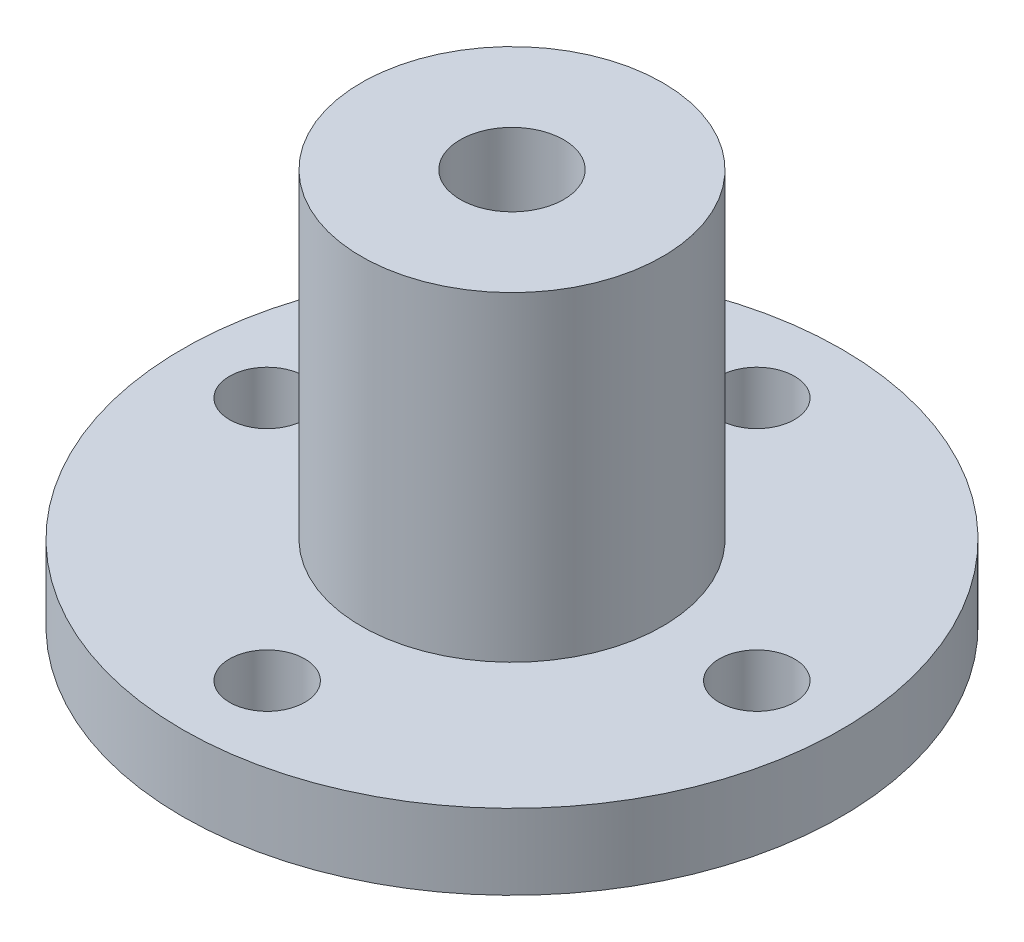
ISO-10303-21;
HEADER;
FILE_DESCRIPTION(('STEP AP214'),'2;1');
FILE_NAME('part.step','',(''),(''),'','','');
FILE_SCHEMA(('AUTOMOTIVE_DESIGN { 1 0 10303 214 1 1 1 1 }'));
ENDSEC;
DATA;
#1=APPLICATION_CONTEXT('core data for automotive mechanical design processes');
#2=APPLICATION_PROTOCOL_DEFINITION('international standard','automotive_design',2000,#1);
#3=PRODUCT_CONTEXT('',#1,'mechanical');
#4=PRODUCT('Part','Part','',(#3));
#5=PRODUCT_RELATED_PRODUCT_CATEGORY('part','',(#4));
#6=PRODUCT_DEFINITION_FORMATION('','',#4);
#7=PRODUCT_DEFINITION_CONTEXT('part definition',#1,'design');
#8=PRODUCT_DEFINITION('design','',#6,#7);
#9=PRODUCT_DEFINITION_SHAPE('','',#8);
#10=(LENGTH_UNIT() NAMED_UNIT(*) SI_UNIT(.MILLI.,.METRE.));
#11=(NAMED_UNIT(*) PLANE_ANGLE_UNIT() SI_UNIT($,.RADIAN.));
#12=(NAMED_UNIT(*) SI_UNIT($,.STERADIAN.) SOLID_ANGLE_UNIT());
#13=UNCERTAINTY_MEASURE_WITH_UNIT(LENGTH_MEASURE(1.E-05),#10,'distance_accuracy_value','');
#14=(GEOMETRIC_REPRESENTATION_CONTEXT(3) GLOBAL_UNCERTAINTY_ASSIGNED_CONTEXT((#13)) GLOBAL_UNIT_ASSIGNED_CONTEXT((#10,
#11,#12)) REPRESENTATION_CONTEXT('',''));
#15=CARTESIAN_POINT('',(0.,0.,0.));
#16=DIRECTION('',(0.,0.,1.));
#17=DIRECTION('',(1.,0.,0.));
#18=AXIS2_PLACEMENT_3D('',#15,#16,#17);
#19=CARTESIAN_POINT('',(0.,4.,0.));
#20=DIRECTION('',(0.,1.,0.));
#21=DIRECTION('',(0.,0.,1.));
#22=AXIS2_PLACEMENT_3D('',#19,#20,#21);
#23=PLANE('',#22);
#24=CARTESIAN_POINT('',(0.,4.,13.));
#25=DIRECTION('',(0.,1.,0.));
#26=DIRECTION('',(0.,0.,1.));
#27=AXIS2_PLACEMENT_3D('',#24,#25,#26);
#28=CIRCLE('',#27,2.);
#29=CARTESIAN_POINT('',(0.,4.,15.));
#30=VERTEX_POINT('',#29);
#31=EDGE_CURVE('E70',#30,#30,#28,.T.);
#32=ORIENTED_EDGE('',*,*,#31,.F.);
#33=EDGE_LOOP('',(#32));
#34=FACE_BOUND('',#33,.T.);
#35=CARTESIAN_POINT('',(0.,4.,-13.));
#36=DIRECTION('',(0.,1.,0.));
#37=DIRECTION('',(0.,0.,1.));
#38=AXIS2_PLACEMENT_3D('',#35,#36,#37);
#39=CIRCLE('',#38,2.);
#40=CARTESIAN_POINT('',(0.,4.,-11.));
#41=VERTEX_POINT('',#40);
#42=EDGE_CURVE('E57',#41,#41,#39,.T.);
#43=ORIENTED_EDGE('',*,*,#42,.F.);
#44=EDGE_LOOP('',(#43));
#45=FACE_BOUND('',#44,.T.);
#46=CARTESIAN_POINT('',(0.,4.,0.));
#47=DIRECTION('',(0.,1.,0.));
#48=DIRECTION('',(0.,0.,1.));
#49=AXIS2_PLACEMENT_3D('',#46,#47,#48);
#50=CIRCLE('',#49,17.5);
#51=CARTESIAN_POINT('',(0.,4.,17.5));
#52=VERTEX_POINT('',#51);
#53=EDGE_CURVE('E10',#52,#52,#50,.T.);
#54=ORIENTED_EDGE('',*,*,#53,.T.);
#55=EDGE_LOOP('',(#54));
#56=FACE_BOUND('',#55,.T.);
#57=CARTESIAN_POINT('',(0.,4.,0.));
#58=DIRECTION('',(0.,1.,0.));
#59=DIRECTION('',(0.,0.,1.));
#60=AXIS2_PLACEMENT_3D('',#57,#58,#59);
#61=CIRCLE('',#60,8.);
#62=CARTESIAN_POINT('',(0.,4.,-8.));
#63=VERTEX_POINT('',#62);
#64=EDGE_CURVE('E52',#63,#63,#61,.T.);
#65=ORIENTED_EDGE('',*,*,#64,.F.);
#66=EDGE_LOOP('',(#65));
#67=FACE_BOUND('',#66,.T.);
#68=CARTESIAN_POINT('',(13.,4.,0.));
#69=DIRECTION('',(0.,1.,0.));
#70=DIRECTION('',(0.,0.,1.));
#71=AXIS2_PLACEMENT_3D('',#68,#69,#70);
#72=CIRCLE('',#71,2.);
#73=CARTESIAN_POINT('',(13.,4.,2.00000000000005));
#74=VERTEX_POINT('',#73);
#75=EDGE_CURVE('E62',#74,#74,#72,.T.);
#76=ORIENTED_EDGE('',*,*,#75,.F.);
#77=EDGE_LOOP('',(#76));
#78=FACE_BOUND('',#77,.T.);
#79=CARTESIAN_POINT('',(-13.,4.,-1.36167772214882E-13));
#80=DIRECTION('',(0.,1.,0.));
#81=DIRECTION('',(0.,0.,1.));
#82=AXIS2_PLACEMENT_3D('',#79,#80,#81);
#83=CIRCLE('',#82,2.);
#84=CARTESIAN_POINT('',(-13.,4.,1.99999999999986));
#85=VERTEX_POINT('',#84);
#86=EDGE_CURVE('E78',#85,#85,#83,.T.);
#87=ORIENTED_EDGE('',*,*,#86,.F.);
#88=EDGE_LOOP('',(#87));
#89=FACE_BOUND('',#88,.T.);
#90=ADVANCED_FACE('F39',(#34,#45,#56,#67,#78,#89),#23,.T.);
#91=CARTESIAN_POINT('',(0.,0.,0.));
#92=DIRECTION('',(0.,1.,0.));
#93=DIRECTION('',(0.,0.,1.));
#94=AXIS2_PLACEMENT_3D('',#91,#92,#93);
#95=PLANE('',#94);
#96=CARTESIAN_POINT('',(0.,0.,0.));
#97=DIRECTION('',(0.,-1.,0.));
#98=DIRECTION('',(0.,0.,-1.));
#99=AXIS2_PLACEMENT_3D('',#96,#97,#98);
#100=CIRCLE('',#99,5.5);
#101=CARTESIAN_POINT('',(0.,0.,-5.5));
#102=VERTEX_POINT('',#101);
#103=EDGE_CURVE('E93',#102,#102,#100,.T.);
#104=ORIENTED_EDGE('',*,*,#103,.F.);
#105=EDGE_LOOP('',(#104));
#106=FACE_BOUND('',#105,.T.);
#107=CARTESIAN_POINT('',(0.,0.,0.));
#108=DIRECTION('',(0.,1.,0.));
#109=DIRECTION('',(0.,0.,1.));
#110=AXIS2_PLACEMENT_3D('',#107,#108,#109);
#111=CIRCLE('',#110,17.5);
#112=CARTESIAN_POINT('',(0.,0.,17.5));
#113=VERTEX_POINT('',#112);
#114=EDGE_CURVE('E43',#113,#113,#111,.T.);
#115=ORIENTED_EDGE('',*,*,#114,.F.);
#116=EDGE_LOOP('',(#115));
#117=FACE_BOUND('',#116,.T.);
#118=CARTESIAN_POINT('',(0.,0.,-13.));
#119=DIRECTION('',(0.,1.,0.));
#120=DIRECTION('',(0.,0.,1.));
#121=AXIS2_PLACEMENT_3D('',#118,#119,#120);
#122=CIRCLE('',#121,2.);
#123=CARTESIAN_POINT('',(0.,0.,-11.));
#124=VERTEX_POINT('',#123);
#125=EDGE_CURVE('E58',#124,#124,#122,.T.);
#126=ORIENTED_EDGE('',*,*,#125,.T.);
#127=EDGE_LOOP('',(#126));
#128=FACE_BOUND('',#127,.T.);
#129=CARTESIAN_POINT('',(13.,0.,0.));
#130=DIRECTION('',(0.,1.,0.));
#131=DIRECTION('',(0.,0.,1.));
#132=AXIS2_PLACEMENT_3D('',#129,#130,#131);
#133=CIRCLE('',#132,2.);
#134=CARTESIAN_POINT('',(13.,0.,2.00000000000005));
#135=VERTEX_POINT('',#134);
#136=EDGE_CURVE('E66',#135,#135,#133,.T.);
#137=ORIENTED_EDGE('',*,*,#136,.T.);
#138=EDGE_LOOP('',(#137));
#139=FACE_BOUND('',#138,.T.);
#140=CARTESIAN_POINT('',(0.,0.,13.));
#141=DIRECTION('',(0.,1.,0.));
#142=DIRECTION('',(0.,0.,1.));
#143=AXIS2_PLACEMENT_3D('',#140,#141,#142);
#144=CIRCLE('',#143,2.);
#145=CARTESIAN_POINT('',(0.,0.,15.));
#146=VERTEX_POINT('',#145);
#147=EDGE_CURVE('E74',#146,#146,#144,.T.);
#148=ORIENTED_EDGE('',*,*,#147,.T.);
#149=EDGE_LOOP('',(#148));
#150=FACE_BOUND('',#149,.T.);
#151=CARTESIAN_POINT('',(-13.,0.,-1.36167772214882E-13));
#152=DIRECTION('',(0.,1.,0.));
#153=DIRECTION('',(0.,0.,1.));
#154=AXIS2_PLACEMENT_3D('',#151,#152,#153);
#155=CIRCLE('',#154,2.);
#156=CARTESIAN_POINT('',(-13.,0.,1.99999999999986));
#157=VERTEX_POINT('',#156);
#158=EDGE_CURVE('E82',#157,#157,#155,.T.);
#159=ORIENTED_EDGE('',*,*,#158,.T.);
#160=EDGE_LOOP('',(#159));
#161=FACE_BOUND('',#160,.T.);
#162=ADVANCED_FACE('F167',(#106,#117,#128,#139,#150,#161),#95,.F.);
#163=CARTESIAN_POINT('',(0.,4.,0.));
#164=DIRECTION('',(0.,-1.,0.));
#165=DIRECTION('',(0.,0.,-1.));
#166=AXIS2_PLACEMENT_3D('',#163,#164,#165);
#167=CYLINDRICAL_SURFACE('',#166,17.5);
#168=ORIENTED_EDGE('',*,*,#53,.F.);
#169=EDGE_LOOP('',(#168));
#170=FACE_BOUND('',#169,.T.);
#171=ORIENTED_EDGE('',*,*,#114,.T.);
#172=EDGE_LOOP('',(#171));
#173=FACE_BOUND('',#172,.T.);
#174=ADVANCED_FACE('F41',(#170,#173),#167,.T.);
#175=CARTESIAN_POINT('',(0.,4.,-13.));
#176=DIRECTION('',(0.,-1.,0.));
#177=DIRECTION('',(0.,0.,-1.));
#178=AXIS2_PLACEMENT_3D('',#175,#176,#177);
#179=CYLINDRICAL_SURFACE('',#178,2.);
#180=ORIENTED_EDGE('',*,*,#42,.T.);
#181=EDGE_LOOP('',(#180));
#182=FACE_BOUND('',#181,.T.);
#183=ORIENTED_EDGE('',*,*,#125,.F.);
#184=EDGE_LOOP('',(#183));
#185=FACE_BOUND('',#184,.T.);
#186=ADVANCED_FACE('F177',(#182,#185),#179,.F.);
#187=CARTESIAN_POINT('',(13.,4.,0.));
#188=DIRECTION('',(0.,-1.,0.));
#189=DIRECTION('',(0.,0.,-1.));
#190=AXIS2_PLACEMENT_3D('',#187,#188,#189);
#191=CYLINDRICAL_SURFACE('',#190,2.);
#192=ORIENTED_EDGE('',*,*,#75,.T.);
#193=EDGE_LOOP('',(#192));
#194=FACE_BOUND('',#193,.T.);
#195=ORIENTED_EDGE('',*,*,#136,.F.);
#196=EDGE_LOOP('',(#195));
#197=FACE_BOUND('',#196,.T.);
#198=ADVANCED_FACE('F180',(#194,#197),#191,.F.);
#199=CARTESIAN_POINT('',(0.,4.,13.));
#200=DIRECTION('',(0.,-1.,0.));
#201=DIRECTION('',(0.,0.,-1.));
#202=AXIS2_PLACEMENT_3D('',#199,#200,#201);
#203=CYLINDRICAL_SURFACE('',#202,2.);
#204=ORIENTED_EDGE('',*,*,#31,.T.);
#205=EDGE_LOOP('',(#204));
#206=FACE_BOUND('',#205,.T.);
#207=ORIENTED_EDGE('',*,*,#147,.F.);
#208=EDGE_LOOP('',(#207));
#209=FACE_BOUND('',#208,.T.);
#210=ADVANCED_FACE('F184',(#206,#209),#203,.F.);
#211=CARTESIAN_POINT('',(-13.,4.,-1.36167772214882E-13));
#212=DIRECTION('',(0.,-1.,0.));
#213=DIRECTION('',(0.,0.,-1.));
#214=AXIS2_PLACEMENT_3D('',#211,#212,#213);
#215=CYLINDRICAL_SURFACE('',#214,2.);
#216=ORIENTED_EDGE('',*,*,#86,.T.);
#217=EDGE_LOOP('',(#216));
#218=FACE_BOUND('',#217,.T.);
#219=ORIENTED_EDGE('',*,*,#158,.F.);
#220=EDGE_LOOP('',(#219));
#221=FACE_BOUND('',#220,.T.);
#222=ADVANCED_FACE('F188',(#218,#221),#215,.F.);
#223=CARTESIAN_POINT('',(0.,21.,0.));
#224=DIRECTION('',(0.,-1.,0.));
#225=DIRECTION('',(0.,0.,-1.));
#226=AXIS2_PLACEMENT_3D('',#223,#224,#225);
#227=CYLINDRICAL_SURFACE('',#226,8.);
#228=CARTESIAN_POINT('',(0.,21.,0.));
#229=DIRECTION('',(0.,1.,0.));
#230=DIRECTION('',(0.,0.,1.));
#231=AXIS2_PLACEMENT_3D('',#228,#229,#230);
#232=CIRCLE('',#231,8.);
#233=CARTESIAN_POINT('',(0.,21.,-8.));
#234=VERTEX_POINT('',#233);
#235=EDGE_CURVE('E86',#234,#234,#232,.T.);
#236=CARTESIAN_POINT('',(0.,4.,-8.));
#237=CARTESIAN_POINT('',(0.,4.17708333333333,-8.));
#238=CARTESIAN_POINT('',(0.,4.35416666666666,-8.));
#239=CARTESIAN_POINT('',(0.,4.70833333333333,-8.));
#240=CARTESIAN_POINT('',(0.,4.88541666666666,-8.));
#241=CARTESIAN_POINT('',(0.,5.23958333333333,-8.));
#242=CARTESIAN_POINT('',(0.,5.41666666666666,-8.));
#243=CARTESIAN_POINT('',(0.,5.77083333333333,-8.));
#244=CARTESIAN_POINT('',(0.,5.94791666666666,-8.));
#245=CARTESIAN_POINT('',(0.,6.30208333333333,-8.));
#246=CARTESIAN_POINT('',(0.,6.47916666666666,-8.));
#247=CARTESIAN_POINT('',(0.,6.83333333333333,-8.));
#248=CARTESIAN_POINT('',(0.,7.01041666666666,-8.));
#249=CARTESIAN_POINT('',(0.,7.36458333333333,-8.));
#250=CARTESIAN_POINT('',(0.,7.54166666666666,-8.));
#251=CARTESIAN_POINT('',(0.,7.89583333333333,-8.));
#252=CARTESIAN_POINT('',(0.,8.07291666666666,-8.));
#253=CARTESIAN_POINT('',(0.,8.42708333333333,-8.));
#254=CARTESIAN_POINT('',(0.,8.60416666666666,-8.));
#255=CARTESIAN_POINT('',(0.,8.95833333333333,-8.));
#256=CARTESIAN_POINT('',(0.,9.13541666666666,-8.));
#257=CARTESIAN_POINT('',(0.,9.48958333333333,-8.));
#258=CARTESIAN_POINT('',(0.,9.66666666666666,-8.));
#259=CARTESIAN_POINT('',(0.,10.0208333333333,-8.));
#260=CARTESIAN_POINT('',(0.,10.1979166666667,-8.));
#261=CARTESIAN_POINT('',(0.,10.5520833333333,-8.));
#262=CARTESIAN_POINT('',(0.,10.7291666666667,-8.));
#263=CARTESIAN_POINT('',(0.,11.0833333333333,-8.));
#264=CARTESIAN_POINT('',(0.,11.2604166666667,-8.));
#265=CARTESIAN_POINT('',(0.,11.6145833333333,-8.));
#266=CARTESIAN_POINT('',(0.,11.7916666666667,-8.));
#267=CARTESIAN_POINT('',(0.,12.1458333333333,-8.));
#268=CARTESIAN_POINT('',(0.,12.3229166666667,-8.));
#269=CARTESIAN_POINT('',(0.,12.6770833333333,-8.));
#270=CARTESIAN_POINT('',(0.,12.8541666666667,-8.));
#271=CARTESIAN_POINT('',(0.,13.2083333333333,-8.));
#272=CARTESIAN_POINT('',(0.,13.3854166666667,-8.));
#273=CARTESIAN_POINT('',(0.,13.7395833333333,-8.));
#274=CARTESIAN_POINT('',(0.,13.9166666666667,-8.));
#275=CARTESIAN_POINT('',(0.,14.2708333333333,-8.));
#276=CARTESIAN_POINT('',(0.,14.4479166666667,-8.));
#277=CARTESIAN_POINT('',(0.,14.8020833333333,-8.));
#278=CARTESIAN_POINT('',(0.,14.9791666666667,-8.));
#279=CARTESIAN_POINT('',(0.,15.3333333333333,-8.));
#280=CARTESIAN_POINT('',(0.,15.5104166666667,-8.));
#281=CARTESIAN_POINT('',(0.,15.8645833333333,-8.));
#282=CARTESIAN_POINT('',(0.,16.0416666666667,-8.));
#283=CARTESIAN_POINT('',(0.,16.3958333333333,-8.));
#284=CARTESIAN_POINT('',(0.,16.5729166666667,-8.));
#285=CARTESIAN_POINT('',(0.,16.9270833333333,-8.));
#286=CARTESIAN_POINT('',(0.,17.1041666666667,-8.));
#287=CARTESIAN_POINT('',(0.,17.4583333333333,-8.));
#288=CARTESIAN_POINT('',(0.,17.6354166666667,-8.));
#289=CARTESIAN_POINT('',(0.,17.9895833333333,-8.));
#290=CARTESIAN_POINT('',(0.,18.1666666666667,-8.));
#291=CARTESIAN_POINT('',(0.,18.5208333333333,-8.));
#292=CARTESIAN_POINT('',(0.,18.6979166666667,-8.));
#293=CARTESIAN_POINT('',(0.,19.0520833333333,-8.));
#294=CARTESIAN_POINT('',(0.,19.2291666666667,-8.));
#295=CARTESIAN_POINT('',(0.,19.5833333333333,-8.));
#296=CARTESIAN_POINT('',(0.,19.7604166666667,-8.));
#297=CARTESIAN_POINT('',(0.,20.1145833333333,-8.));
#298=CARTESIAN_POINT('',(0.,20.2916666666667,-8.));
#299=CARTESIAN_POINT('',(0.,20.6458333333333,-8.));
#300=CARTESIAN_POINT('',(0.,20.8229166666667,-8.));
#301=CARTESIAN_POINT('',(0.,21.,-8.));
#302=B_SPLINE_CURVE_WITH_KNOTS('',3,(#236,#237,#238,#239,#240,#241,#242,#243,#244,#245,#246,
#247,#248,#249,#250,#251,#252,#253,#254,#255,#256,#257,#258,#259,#260,#261,#262,#263,#264,#265,
#266,#267,#268,#269,#270,#271,#272,#273,#274,#275,#276,#277,#278,#279,#280,#281,#282,#283,#284,
#285,#286,#287,#288,#289,#290,#291,#292,#293,#294,#295,#296,#297,#298,#299,#300,#301),
.UNSPECIFIED.,.F.,.F.,(4,2,2,2,2,2,2,2,2,2,2,2,2,2,2,2,2,2,2,2,2,2,2,2,2,2,2,2,2,2,2,2,4),(0.,
0.53125,1.0625,1.59375,2.125,2.65625,3.1875,3.71875,4.25,4.78125,5.3125,5.84375,6.375,6.90625,
7.4375,7.96875,8.5,9.03125,9.5625,10.09375,10.625,11.15625,11.6875,12.21875,12.75,13.28125,
13.8125,14.34375,14.875,15.40625,15.9375,16.46875,17.),.UNSPECIFIED.);
#303=EDGE_CURVE('BSEAM192',#63,#234,#302,.T.);
#304=ORIENTED_EDGE('',*,*,#64,.T.);
#305=ORIENTED_EDGE('',*,*,#235,.F.);
#306=ORIENTED_EDGE('',*,*,#303,.T.);
#307=ORIENTED_EDGE('',*,*,#303,.F.);
#308=EDGE_LOOP('',(#304,#306,#305,#307));
#309=FACE_BOUND('',#308,.T.);
#310=ADVANCED_FACE('F192',(#309),#227,.T.);
#311=CARTESIAN_POINT('',(0.,21.,0.));
#312=DIRECTION('',(0.,1.,0.));
#313=DIRECTION('',(0.,0.,1.));
#314=AXIS2_PLACEMENT_3D('',#311,#312,#313);
#315=PLANE('',#314);
#316=CARTESIAN_POINT('',(0.,21.,0.));
#317=DIRECTION('',(0.,-1.,0.));
#318=DIRECTION('',(0.,0.,-1.));
#319=AXIS2_PLACEMENT_3D('',#316,#317,#318);
#320=CIRCLE('',#319,2.75);
#321=CARTESIAN_POINT('',(0.,21.,-2.75));
#322=VERTEX_POINT('',#321);
#323=EDGE_CURVE('E114',#322,#322,#320,.T.);
#324=ORIENTED_EDGE('',*,*,#323,.T.);
#325=EDGE_LOOP('',(#324));
#326=FACE_BOUND('',#325,.T.);
#327=ORIENTED_EDGE('',*,*,#235,.T.);
#328=EDGE_LOOP('',(#327));
#329=FACE_BOUND('',#328,.T.);
#330=ADVANCED_FACE('F126',(#326,#329),#315,.T.);
#331=CARTESIAN_POINT('',(0.,12.,0.));
#332=DIRECTION('',(0.,-1.,0.));
#333=DIRECTION('',(0.,0.,-1.));
#334=AXIS2_PLACEMENT_3D('',#331,#332,#333);
#335=CYLINDRICAL_SURFACE('',#334,5.5);
#336=CARTESIAN_POINT('',(0.,12.,0.));
#337=DIRECTION('',(0.,-1.,0.));
#338=DIRECTION('',(0.,0.,-1.));
#339=AXIS2_PLACEMENT_3D('',#336,#337,#338);
#340=CIRCLE('',#339,5.5);
#341=CARTESIAN_POINT('',(0.,12.,-5.5));
#342=VERTEX_POINT('',#341);
#343=EDGE_CURVE('E97',#342,#342,#340,.T.);
#344=ORIENTED_EDGE('',*,*,#343,.F.);
#345=EDGE_LOOP('',(#344));
#346=FACE_BOUND('',#345,.T.);
#347=ORIENTED_EDGE('',*,*,#103,.T.);
#348=EDGE_LOOP('',(#347));
#349=FACE_BOUND('',#348,.T.);
#350=ADVANCED_FACE('F157',(#346,#349),#335,.F.);
#351=CARTESIAN_POINT('',(0.,13.1,0.));
#352=DIRECTION('',(0.,-1.,0.));
#353=DIRECTION('',(0.,0.,-1.));
#354=AXIS2_PLACEMENT_3D('',#351,#352,#353);
#355=CYLINDRICAL_SURFACE('',#354,6.);
#356=CARTESIAN_POINT('',(0.,13.1,0.));
#357=DIRECTION('',(0.,-1.,0.));
#358=DIRECTION('',(0.,0.,-1.));
#359=AXIS2_PLACEMENT_3D('',#356,#357,#358);
#360=CIRCLE('',#359,6.);
#361=CARTESIAN_POINT('',(0.,13.1,-6.));
#362=VERTEX_POINT('',#361);
#363=EDGE_CURVE('E101',#362,#362,#360,.T.);
#364=ORIENTED_EDGE('',*,*,#363,.F.);
#365=EDGE_LOOP('',(#364));
#366=FACE_BOUND('',#365,.T.);
#367=CARTESIAN_POINT('',(0.,12.,0.));
#368=DIRECTION('',(0.,-1.,0.));
#369=DIRECTION('',(0.,0.,-1.));
#370=AXIS2_PLACEMENT_3D('',#367,#368,#369);
#371=CIRCLE('',#370,6.);
#372=CARTESIAN_POINT('',(0.,12.,-6.));
#373=VERTEX_POINT('',#372);
#374=EDGE_CURVE('E102',#373,#373,#371,.T.);
#375=ORIENTED_EDGE('',*,*,#374,.T.);
#376=EDGE_LOOP('',(#375));
#377=FACE_BOUND('',#376,.T.);
#378=ADVANCED_FACE('F151',(#366,#377),#355,.F.);
#379=CARTESIAN_POINT('',(0.,13.1,0.));
#380=DIRECTION('',(0.,-1.,0.));
#381=DIRECTION('',(0.,0.,-1.));
#382=AXIS2_PLACEMENT_3D('',#379,#380,#381);
#383=PLANE('',#382);
#384=CARTESIAN_POINT('',(0.,13.1,0.));
#385=DIRECTION('',(0.,-1.,0.));
#386=DIRECTION('',(0.,0.,-1.));
#387=AXIS2_PLACEMENT_3D('',#384,#385,#386);
#388=CIRCLE('',#387,5.5);
#389=CARTESIAN_POINT('',(0.,13.1,-5.5));
#390=VERTEX_POINT('',#389);
#391=EDGE_CURVE('E110',#390,#390,#388,.T.);
#392=ORIENTED_EDGE('',*,*,#391,.F.);
#393=EDGE_LOOP('',(#392));
#394=FACE_BOUND('',#393,.T.);
#395=ORIENTED_EDGE('',*,*,#363,.T.);
#396=EDGE_LOOP('',(#395));
#397=FACE_BOUND('',#396,.T.);
#398=ADVANCED_FACE('F148',(#394,#397),#383,.T.);
#399=CARTESIAN_POINT('',(0.,12.,0.));
#400=DIRECTION('',(0.,-1.,0.));
#401=DIRECTION('',(0.,0.,-1.));
#402=AXIS2_PLACEMENT_3D('',#399,#400,#401);
#403=PLANE('',#402);
#404=ORIENTED_EDGE('',*,*,#343,.T.);
#405=EDGE_LOOP('',(#404));
#406=FACE_BOUND('',#405,.T.);
#407=ORIENTED_EDGE('',*,*,#374,.F.);
#408=EDGE_LOOP('',(#407));
#409=FACE_BOUND('',#408,.T.);
#410=ADVANCED_FACE('F144',(#406,#409),#403,.F.);
#411=CARTESIAN_POINT('',(0.,16.,0.));
#412=DIRECTION('',(0.,-1.,0.));
#413=DIRECTION('',(0.,0.,-1.));
#414=AXIS2_PLACEMENT_3D('',#411,#412,#413);
#415=CYLINDRICAL_SURFACE('',#414,5.5);
#416=CARTESIAN_POINT('',(0.,16.,0.));
#417=DIRECTION('',(0.,-1.,0.));
#418=DIRECTION('',(0.,0.,-1.));
#419=AXIS2_PLACEMENT_3D('',#416,#417,#418);
#420=CIRCLE('',#419,5.5);
#421=CARTESIAN_POINT('',(0.,16.,-5.5));
#422=VERTEX_POINT('',#421);
#423=EDGE_CURVE('E106',#422,#422,#420,.T.);
#424=ORIENTED_EDGE('',*,*,#423,.F.);
#425=EDGE_LOOP('',(#424));
#426=FACE_BOUND('',#425,.T.);
#427=ORIENTED_EDGE('',*,*,#391,.T.);
#428=EDGE_LOOP('',(#427));
#429=FACE_BOUND('',#428,.T.);
#430=ADVANCED_FACE('F138',(#426,#429),#415,.F.);
#431=CARTESIAN_POINT('',(0.,16.,0.));
#432=DIRECTION('',(0.,-1.,0.));
#433=DIRECTION('',(0.,0.,-1.));
#434=AXIS2_PLACEMENT_3D('',#431,#432,#433);
#435=PLANE('',#434);
#436=CARTESIAN_POINT('',(0.,16.,0.));
#437=DIRECTION('',(0.,-1.,0.));
#438=DIRECTION('',(0.,0.,-1.));
#439=AXIS2_PLACEMENT_3D('',#436,#437,#438);
#440=CIRCLE('',#439,2.75);
#441=CARTESIAN_POINT('',(0.,16.,-2.75));
#442=VERTEX_POINT('',#441);
#443=EDGE_CURVE('E118',#442,#442,#440,.T.);
#444=ORIENTED_EDGE('',*,*,#443,.F.);
#445=EDGE_LOOP('',(#444));
#446=FACE_BOUND('',#445,.T.);
#447=ORIENTED_EDGE('',*,*,#423,.T.);
#448=EDGE_LOOP('',(#447));
#449=FACE_BOUND('',#448,.T.);
#450=ADVANCED_FACE('F132',(#446,#449),#435,.T.);
#451=CARTESIAN_POINT('',(0.,21.,0.));
#452=DIRECTION('',(0.,-1.,0.));
#453=DIRECTION('',(0.,0.,-1.));
#454=AXIS2_PLACEMENT_3D('',#451,#452,#453);
#455=CYLINDRICAL_SURFACE('',#454,2.75);
#456=ORIENTED_EDGE('',*,*,#323,.F.);
#457=EDGE_LOOP('',(#456));
#458=FACE_BOUND('',#457,.T.);
#459=ORIENTED_EDGE('',*,*,#443,.T.);
#460=EDGE_LOOP('',(#459));
#461=FACE_BOUND('',#460,.T.);
#462=ADVANCED_FACE('F129',(#458,#461),#455,.F.);
#463=CLOSED_SHELL('',(#90,#162,#174,#186,#198,#210,#222,#310,#330,#350,#378,#398,#410,#430,#450,#462));
#464=MANIFOLD_SOLID_BREP('B2',#463);
#465=ADVANCED_BREP_SHAPE_REPRESENTATION('',(#18,#464),#14);
#466=SHAPE_DEFINITION_REPRESENTATION(#9,#465);
ENDSEC;
END-ISO-10303-21;
